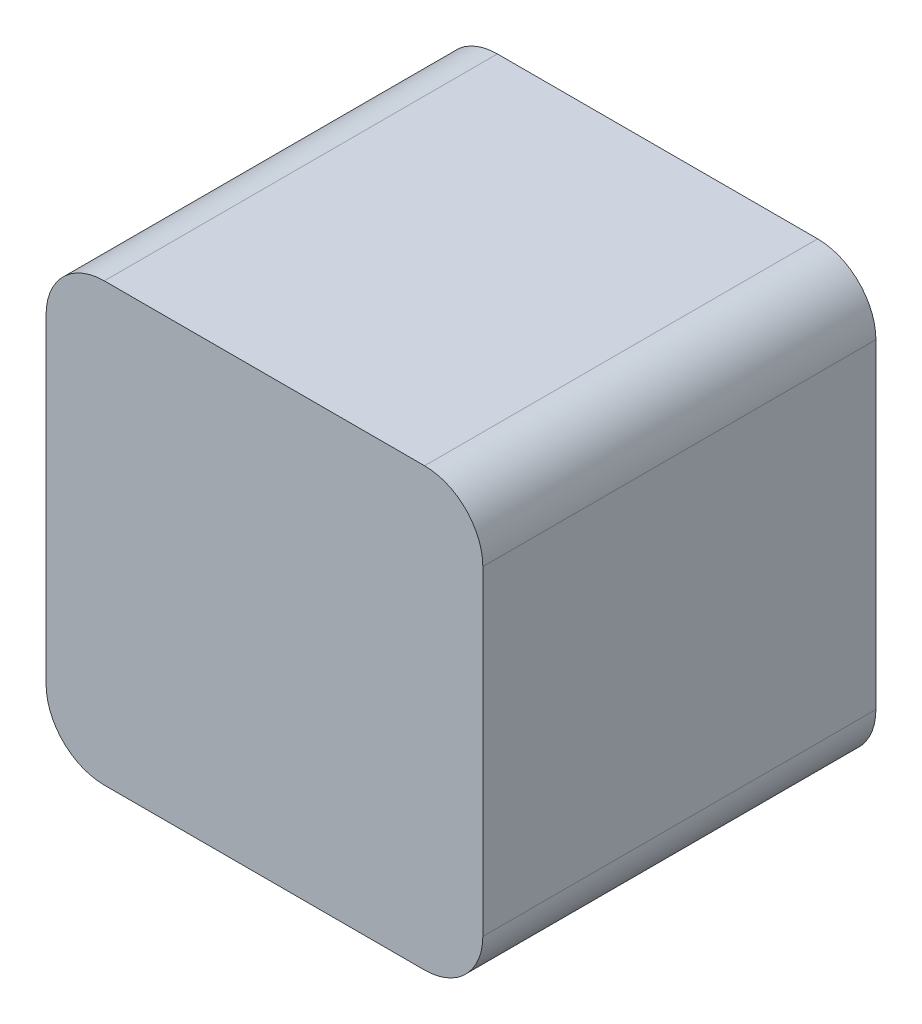
ISO-10303-21;
HEADER;
FILE_DESCRIPTION(('STEP AP214'),'2;1');
FILE_NAME('part.step','',(''),(''),'','','');
FILE_SCHEMA(('AUTOMOTIVE_DESIGN { 1 0 10303 214 1 1 1 1 }'));
ENDSEC;
DATA;
#1=APPLICATION_CONTEXT('core data for automotive mechanical design processes');
#2=APPLICATION_PROTOCOL_DEFINITION('international standard','automotive_design',2000,#1);
#3=PRODUCT_CONTEXT('',#1,'mechanical');
#4=PRODUCT('Part','Part','',(#3));
#5=PRODUCT_RELATED_PRODUCT_CATEGORY('part','',(#4));
#6=PRODUCT_DEFINITION_FORMATION('','',#4);
#7=PRODUCT_DEFINITION_CONTEXT('part definition',#1,'design');
#8=PRODUCT_DEFINITION('design','',#6,#7);
#9=PRODUCT_DEFINITION_SHAPE('','',#8);
#10=(LENGTH_UNIT() NAMED_UNIT(*) SI_UNIT(.MILLI.,.METRE.));
#11=(NAMED_UNIT(*) PLANE_ANGLE_UNIT() SI_UNIT($,.RADIAN.));
#12=(NAMED_UNIT(*) SI_UNIT($,.STERADIAN.) SOLID_ANGLE_UNIT());
#13=UNCERTAINTY_MEASURE_WITH_UNIT(LENGTH_MEASURE(1.E-05),#10,'distance_accuracy_value','');
#14=(GEOMETRIC_REPRESENTATION_CONTEXT(3) GLOBAL_UNCERTAINTY_ASSIGNED_CONTEXT((#13)) GLOBAL_UNIT_ASSIGNED_CONTEXT((#10,
#11,#12)) REPRESENTATION_CONTEXT('',''));
#15=CARTESIAN_POINT('',(0.,0.,0.));
#16=DIRECTION('',(0.,0.,1.));
#17=DIRECTION('',(1.,0.,0.));
#18=AXIS2_PLACEMENT_3D('',#15,#16,#17);
#19=CARTESIAN_POINT('',(7.5,-7.5,-11.));
#20=DIRECTION('',(1.,0.,0.));
#21=DIRECTION('',(0.,0.,-1.));
#22=AXIS2_PLACEMENT_3D('',#19,#20,#21);
#23=PLANE('',#22);
#24=DIRECTION('',(0.,1.,0.));
#25=VECTOR('',#24,1.);
#26=CARTESIAN_POINT('',(7.5,-7.5,-11.));
#27=LINE('',#26,#25);
#28=CARTESIAN_POINT('',(7.5,-5.5,-11.));
#29=VERTEX_POINT('',#28);
#30=CARTESIAN_POINT('',(7.5,5.5,-11.));
#31=VERTEX_POINT('',#30);
#32=EDGE_CURVE('E187',#29,#31,#27,.T.);
#33=ORIENTED_EDGE('',*,*,#32,.T.);
#34=DIRECTION('',(0.,0.,1.));
#35=VECTOR('',#34,1.);
#36=CARTESIAN_POINT('',(7.5,5.5,-11.));
#37=LINE('',#36,#35);
#38=CARTESIAN_POINT('',(7.5,5.5,2.5));
#39=VERTEX_POINT('',#38);
#40=EDGE_CURVE('E127',#31,#39,#37,.T.);
#41=ORIENTED_EDGE('',*,*,#40,.T.);
#42=DIRECTION('',(0.,1.,0.));
#43=VECTOR('',#42,1.);
#44=CARTESIAN_POINT('',(7.5,-5.5,2.5));
#45=LINE('',#44,#43);
#46=CARTESIAN_POINT('',(7.5,-5.5,2.5));
#47=VERTEX_POINT('',#46);
#48=EDGE_CURVE('E131',#47,#39,#45,.T.);
#49=ORIENTED_EDGE('',*,*,#48,.F.);
#50=DIRECTION('',(0.,0.,1.));
#51=VECTOR('',#50,1.);
#52=CARTESIAN_POINT('',(7.5,-5.5,-11.));
#53=LINE('',#52,#51);
#54=EDGE_CURVE('E116',#47,#29,#53,.F.);
#55=ORIENTED_EDGE('',*,*,#54,.T.);
#56=EDGE_LOOP('',(#33,#41,#49,#55));
#57=FACE_BOUND('',#56,.T.);
#58=ADVANCED_FACE('F39',(#57),#23,.T.);
#59=CARTESIAN_POINT('',(-7.5,-7.5,-11.));
#60=DIRECTION('',(0.,-1.,0.));
#61=DIRECTION('',(0.,0.,-1.));
#62=AXIS2_PLACEMENT_3D('',#59,#60,#61);
#63=PLANE('',#62);
#64=DIRECTION('',(1.,0.,0.));
#65=VECTOR('',#64,1.);
#66=CARTESIAN_POINT('',(-7.5,-7.5,-11.));
#67=LINE('',#66,#65);
#68=CARTESIAN_POINT('',(-5.5,-7.5,-11.));
#69=VERTEX_POINT('',#68);
#70=CARTESIAN_POINT('',(5.5,-7.5,-11.));
#71=VERTEX_POINT('',#70);
#72=EDGE_CURVE('E128',#69,#71,#67,.T.);
#73=ORIENTED_EDGE('',*,*,#72,.T.);
#74=DIRECTION('',(0.,0.,1.));
#75=VECTOR('',#74,1.);
#76=CARTESIAN_POINT('',(5.5,-7.5,-11.));
#77=LINE('',#76,#75);
#78=CARTESIAN_POINT('',(5.5,-7.5,2.5));
#79=VERTEX_POINT('',#78);
#80=EDGE_CURVE('E224',#71,#79,#77,.T.);
#81=ORIENTED_EDGE('',*,*,#80,.T.);
#82=DIRECTION('',(1.,0.,0.));
#83=VECTOR('',#82,1.);
#84=CARTESIAN_POINT('',(-5.5,-7.5,2.5));
#85=LINE('',#84,#83);
#86=CARTESIAN_POINT('',(-5.5,-7.5,2.5));
#87=VERTEX_POINT('',#86);
#88=EDGE_CURVE('E143',#87,#79,#85,.T.);
#89=ORIENTED_EDGE('',*,*,#88,.F.);
#90=DIRECTION('',(0.,0.,1.));
#91=VECTOR('',#90,1.);
#92=CARTESIAN_POINT('',(-5.5,-7.5,-11.));
#93=LINE('',#92,#91);
#94=EDGE_CURVE('E221',#87,#69,#93,.F.);
#95=ORIENTED_EDGE('',*,*,#94,.T.);
#96=EDGE_LOOP('',(#73,#81,#89,#95));
#97=FACE_BOUND('',#96,.T.);
#98=ADVANCED_FACE('F233',(#97),#63,.T.);
#99=CARTESIAN_POINT('',(-7.5,-7.5,-11.));
#100=DIRECTION('',(-1.,0.,0.));
#101=DIRECTION('',(0.,0.,1.));
#102=AXIS2_PLACEMENT_3D('',#99,#100,#101);
#103=PLANE('',#102);
#104=DIRECTION('',(0.,0.,1.));
#105=VECTOR('',#104,1.);
#106=CARTESIAN_POINT('',(-7.5,-5.5,-11.));
#107=LINE('',#106,#105);
#108=CARTESIAN_POINT('',(-7.5,-5.5,-11.));
#109=VERTEX_POINT('',#108);
#110=CARTESIAN_POINT('',(-7.5,-5.5,2.5));
#111=VERTEX_POINT('',#110);
#112=EDGE_CURVE('E48',#109,#111,#107,.T.);
#113=ORIENTED_EDGE('',*,*,#112,.T.);
#114=DIRECTION('',(0.,-1.,0.));
#115=VECTOR('',#114,1.);
#116=CARTESIAN_POINT('',(-7.5,5.5,2.5));
#117=LINE('',#116,#115);
#118=CARTESIAN_POINT('',(-7.5,5.5,2.5));
#119=VERTEX_POINT('',#118);
#120=EDGE_CURVE('E157',#119,#111,#117,.T.);
#121=ORIENTED_EDGE('',*,*,#120,.F.);
#122=DIRECTION('',(0.,0.,1.));
#123=VECTOR('',#122,1.);
#124=CARTESIAN_POINT('',(-7.5,5.5,-11.));
#125=LINE('',#124,#123);
#126=CARTESIAN_POINT('',(-7.5,5.5,-11.));
#127=VERTEX_POINT('',#126);
#128=EDGE_CURVE('E11',#119,#127,#125,.F.);
#129=ORIENTED_EDGE('',*,*,#128,.T.);
#130=DIRECTION('',(0.,-1.,0.));
#131=VECTOR('',#130,1.);
#132=CARTESIAN_POINT('',(-7.5,-7.5,-11.));
#133=LINE('',#132,#131);
#134=EDGE_CURVE('E197',#127,#109,#133,.T.);
#135=ORIENTED_EDGE('',*,*,#134,.T.);
#136=EDGE_LOOP('',(#113,#121,#129,#135));
#137=FACE_BOUND('',#136,.T.);
#138=ADVANCED_FACE('F228',(#137),#103,.T.);
#139=CARTESIAN_POINT('',(-7.5,7.5,-11.));
#140=DIRECTION('',(0.,1.,0.));
#141=DIRECTION('',(0.,0.,1.));
#142=AXIS2_PLACEMENT_3D('',#139,#140,#141);
#143=PLANE('',#142);
#144=DIRECTION('',(0.,0.,1.));
#145=VECTOR('',#144,1.);
#146=CARTESIAN_POINT('',(-5.5,7.5,-11.));
#147=LINE('',#146,#145);
#148=CARTESIAN_POINT('',(-5.5,7.5,-11.));
#149=VERTEX_POINT('',#148);
#150=CARTESIAN_POINT('',(-5.5,7.5,2.5));
#151=VERTEX_POINT('',#150);
#152=EDGE_CURVE('E205',#149,#151,#147,.T.);
#153=ORIENTED_EDGE('',*,*,#152,.T.);
#154=DIRECTION('',(-1.,0.,0.));
#155=VECTOR('',#154,1.);
#156=CARTESIAN_POINT('',(5.5,7.5,2.5));
#157=LINE('',#156,#155);
#158=CARTESIAN_POINT('',(5.5,7.5,2.5));
#159=VERTEX_POINT('',#158);
#160=EDGE_CURVE('E149',#159,#151,#157,.T.);
#161=ORIENTED_EDGE('',*,*,#160,.F.);
#162=DIRECTION('',(0.,0.,1.));
#163=VECTOR('',#162,1.);
#164=CARTESIAN_POINT('',(5.5,7.5,-11.));
#165=LINE('',#164,#163);
#166=CARTESIAN_POINT('',(5.5,7.5,-11.));
#167=VERTEX_POINT('',#166);
#168=EDGE_CURVE('E208',#159,#167,#165,.F.);
#169=ORIENTED_EDGE('',*,*,#168,.T.);
#170=DIRECTION('',(-1.,0.,0.));
#171=VECTOR('',#170,1.);
#172=CARTESIAN_POINT('',(-7.5,7.5,-11.));
#173=LINE('',#172,#171);
#174=EDGE_CURVE('E193',#167,#149,#173,.T.);
#175=ORIENTED_EDGE('',*,*,#174,.T.);
#176=EDGE_LOOP('',(#153,#161,#169,#175));
#177=FACE_BOUND('',#176,.T.);
#178=ADVANCED_FACE('F241',(#177),#143,.T.);
#179=CARTESIAN_POINT('',(0.,0.,-11.));
#180=DIRECTION('',(0.,0.,-1.));
#181=DIRECTION('',(-1.,0.,0.));
#182=AXIS2_PLACEMENT_3D('',#179,#180,#181);
#183=PLANE('',#182);
#184=CARTESIAN_POINT('',(0.,0.,-11.));
#185=DIRECTION('',(0.,0.,1.));
#186=DIRECTION('',(1.,0.,0.));
#187=AXIS2_PLACEMENT_3D('',#184,#185,#186);
#188=CIRCLE('',#187,3.);
#189=CARTESIAN_POINT('',(-1.6583123951777,2.5,-11.));
#190=VERTEX_POINT('',#189);
#191=CARTESIAN_POINT('',(1.6583123951777,2.5,-11.));
#192=VERTEX_POINT('',#191);
#193=EDGE_CURVE('E167',#190,#192,#188,.T.);
#194=ORIENTED_EDGE('',*,*,#193,.T.);
#195=DIRECTION('',(-1.,0.,0.));
#196=VECTOR('',#195,1.);
#197=CARTESIAN_POINT('',(-1.6583123951777,2.5,-11.));
#198=LINE('',#197,#196);
#199=EDGE_CURVE('E171',#192,#190,#198,.T.);
#200=ORIENTED_EDGE('',*,*,#199,.T.);
#201=EDGE_LOOP('',(#194,#200));
#202=FACE_BOUND('',#201,.T.);
#203=ORIENTED_EDGE('',*,*,#174,.F.);
#204=CARTESIAN_POINT('',(5.5,5.5,-11.));
#205=DIRECTION('',(0.,0.,-1.));
#206=DIRECTION('',(-1.,0.,0.));
#207=AXIS2_PLACEMENT_3D('',#204,#205,#206);
#208=CIRCLE('',#207,2.);
#209=EDGE_CURVE('E218',#167,#31,#208,.T.);
#210=ORIENTED_EDGE('',*,*,#209,.T.);
#211=ORIENTED_EDGE('',*,*,#32,.F.);
#212=CARTESIAN_POINT('',(5.5,-5.5,-11.));
#213=DIRECTION('',(0.,0.,-1.));
#214=DIRECTION('',(-1.,0.,0.));
#215=AXIS2_PLACEMENT_3D('',#212,#213,#214);
#216=CIRCLE('',#215,2.);
#217=EDGE_CURVE('E122',#29,#71,#216,.T.);
#218=ORIENTED_EDGE('',*,*,#217,.T.);
#219=ORIENTED_EDGE('',*,*,#72,.F.);
#220=CARTESIAN_POINT('',(-5.5,-5.5,-11.));
#221=DIRECTION('',(0.,0.,-1.));
#222=DIRECTION('',(-1.,0.,0.));
#223=AXIS2_PLACEMENT_3D('',#220,#221,#222);
#224=CIRCLE('',#223,2.);
#225=EDGE_CURVE('E55',#69,#109,#224,.T.);
#226=ORIENTED_EDGE('',*,*,#225,.T.);
#227=ORIENTED_EDGE('',*,*,#134,.F.);
#228=CARTESIAN_POINT('',(-5.5,5.5,-11.));
#229=DIRECTION('',(0.,0.,-1.));
#230=DIRECTION('',(-1.,0.,0.));
#231=AXIS2_PLACEMENT_3D('',#228,#229,#230);
#232=CIRCLE('',#231,2.);
#233=EDGE_CURVE('E213',#127,#149,#232,.T.);
#234=ORIENTED_EDGE('',*,*,#233,.T.);
#235=EDGE_LOOP('',(#203,#210,#211,#218,#219,#226,#227,#234));
#236=FACE_BOUND('',#235,.T.);
#237=ADVANCED_FACE('F235',(#202,#236),#183,.T.);
#238=CARTESIAN_POINT('',(0.,0.,-11.));
#239=DIRECTION('',(0.,0.,1.));
#240=DIRECTION('',(1.,0.,0.));
#241=AXIS2_PLACEMENT_3D('',#238,#239,#240);
#242=CYLINDRICAL_SURFACE('',#241,3.);
#243=CARTESIAN_POINT('',(0.,0.,0.));
#244=DIRECTION('',(0.,0.,1.));
#245=DIRECTION('',(1.,0.,0.));
#246=AXIS2_PLACEMENT_3D('',#243,#244,#245);
#247=CIRCLE('',#246,3.);
#248=CARTESIAN_POINT('',(-1.6583123951777,2.5,0.));
#249=VERTEX_POINT('',#248);
#250=CARTESIAN_POINT('',(1.6583123951777,2.5,0.));
#251=VERTEX_POINT('',#250);
#252=EDGE_CURVE('E166',#249,#251,#247,.T.);
#253=ORIENTED_EDGE('',*,*,#252,.T.);
#254=DIRECTION('',(0.,0.,1.));
#255=VECTOR('',#254,1.);
#256=CARTESIAN_POINT('',(1.6583123951777,2.5,-11.));
#257=LINE('',#256,#255);
#258=EDGE_CURVE('E176',#192,#251,#257,.T.);
#259=ORIENTED_EDGE('',*,*,#258,.F.);
#260=ORIENTED_EDGE('',*,*,#193,.F.);
#261=DIRECTION('',(0.,0.,1.));
#262=VECTOR('',#261,1.);
#263=CARTESIAN_POINT('',(-1.6583123951777,2.5,-11.));
#264=LINE('',#263,#262);
#265=EDGE_CURVE('E183',#190,#249,#264,.T.);
#266=ORIENTED_EDGE('',*,*,#265,.T.);
#267=EDGE_LOOP('',(#253,#259,#260,#266));
#268=FACE_BOUND('',#267,.T.);
#269=ADVANCED_FACE('F267',(#268),#242,.F.);
#270=CARTESIAN_POINT('',(-1.6583123951777,2.5,-11.));
#271=DIRECTION('',(0.,1.,0.));
#272=DIRECTION('',(0.,0.,1.));
#273=AXIS2_PLACEMENT_3D('',#270,#271,#272);
#274=PLANE('',#273);
#275=DIRECTION('',(-1.,0.,0.));
#276=VECTOR('',#275,1.);
#277=CARTESIAN_POINT('',(-1.6583123951777,2.5,0.));
#278=LINE('',#277,#276);
#279=EDGE_CURVE('E172',#251,#249,#278,.T.);
#280=ORIENTED_EDGE('',*,*,#279,.T.);
#281=ORIENTED_EDGE('',*,*,#265,.F.);
#282=ORIENTED_EDGE('',*,*,#199,.F.);
#283=ORIENTED_EDGE('',*,*,#258,.T.);
#284=EDGE_LOOP('',(#280,#281,#282,#283));
#285=FACE_BOUND('',#284,.T.);
#286=ADVANCED_FACE('F263',(#285),#274,.F.);
#287=CARTESIAN_POINT('',(5.5,5.5,-11.));
#288=DIRECTION('',(0.,0.,1.));
#289=DIRECTION('',(1.,0.,0.));
#290=AXIS2_PLACEMENT_3D('',#287,#288,#289);
#291=CYLINDRICAL_SURFACE('',#290,2.);
#292=ORIENTED_EDGE('',*,*,#209,.F.);
#293=ORIENTED_EDGE('',*,*,#168,.F.);
#294=CARTESIAN_POINT('',(5.5,5.5,2.5));
#295=DIRECTION('',(0.,0.,1.));
#296=DIRECTION('',(1.,0.,0.));
#297=AXIS2_PLACEMENT_3D('',#294,#295,#296);
#298=CIRCLE('',#297,2.);
#299=EDGE_CURVE('E137',#39,#159,#298,.T.);
#300=ORIENTED_EDGE('',*,*,#299,.F.);
#301=ORIENTED_EDGE('',*,*,#40,.F.);
#302=EDGE_LOOP('',(#292,#293,#300,#301));
#303=FACE_BOUND('',#302,.T.);
#304=ADVANCED_FACE('F238',(#303),#291,.T.);
#305=CARTESIAN_POINT('',(5.5,-5.5,-11.));
#306=DIRECTION('',(0.,0.,1.));
#307=DIRECTION('',(1.,0.,0.));
#308=AXIS2_PLACEMENT_3D('',#305,#306,#307);
#309=CYLINDRICAL_SURFACE('',#308,2.);
#310=ORIENTED_EDGE('',*,*,#217,.F.);
#311=ORIENTED_EDGE('',*,*,#54,.F.);
#312=CARTESIAN_POINT('',(5.5,-5.5,2.5));
#313=DIRECTION('',(0.,0.,1.));
#314=DIRECTION('',(1.,0.,0.));
#315=AXIS2_PLACEMENT_3D('',#312,#313,#314);
#316=CIRCLE('',#315,2.);
#317=EDGE_CURVE('E121',#79,#47,#316,.T.);
#318=ORIENTED_EDGE('',*,*,#317,.F.);
#319=ORIENTED_EDGE('',*,*,#80,.F.);
#320=EDGE_LOOP('',(#310,#311,#318,#319));
#321=FACE_BOUND('',#320,.T.);
#322=ADVANCED_FACE('F118',(#321),#309,.T.);
#323=CARTESIAN_POINT('',(-5.5,5.5,-11.));
#324=DIRECTION('',(0.,0.,1.));
#325=DIRECTION('',(1.,0.,0.));
#326=AXIS2_PLACEMENT_3D('',#323,#324,#325);
#327=CYLINDRICAL_SURFACE('',#326,2.);
#328=ORIENTED_EDGE('',*,*,#233,.F.);
#329=ORIENTED_EDGE('',*,*,#128,.F.);
#330=CARTESIAN_POINT('',(-5.5,5.5,2.5));
#331=DIRECTION('',(0.,0.,1.));
#332=DIRECTION('',(1.,0.,0.));
#333=AXIS2_PLACEMENT_3D('',#330,#331,#332);
#334=CIRCLE('',#333,2.);
#335=EDGE_CURVE('E153',#151,#119,#334,.T.);
#336=ORIENTED_EDGE('',*,*,#335,.F.);
#337=ORIENTED_EDGE('',*,*,#152,.F.);
#338=EDGE_LOOP('',(#328,#329,#336,#337));
#339=FACE_BOUND('',#338,.T.);
#340=ADVANCED_FACE('F245',(#339),#327,.T.);
#341=CARTESIAN_POINT('',(-5.5,-5.5,-11.));
#342=DIRECTION('',(0.,0.,1.));
#343=DIRECTION('',(1.,0.,0.));
#344=AXIS2_PLACEMENT_3D('',#341,#342,#343);
#345=CYLINDRICAL_SURFACE('',#344,2.);
#346=ORIENTED_EDGE('',*,*,#225,.F.);
#347=ORIENTED_EDGE('',*,*,#94,.F.);
#348=CARTESIAN_POINT('',(-5.5,-5.5,2.5));
#349=DIRECTION('',(0.,0.,1.));
#350=DIRECTION('',(1.,0.,0.));
#351=AXIS2_PLACEMENT_3D('',#348,#349,#350);
#352=CIRCLE('',#351,2.);
#353=EDGE_CURVE('E161',#111,#87,#352,.T.);
#354=ORIENTED_EDGE('',*,*,#353,.F.);
#355=ORIENTED_EDGE('',*,*,#112,.F.);
#356=EDGE_LOOP('',(#346,#347,#354,#355));
#357=FACE_BOUND('',#356,.T.);
#358=ADVANCED_FACE('F41',(#357),#345,.T.);
#359=CARTESIAN_POINT('',(5.5,-5.5,0.));
#360=DIRECTION('',(0.,0.,1.));
#361=DIRECTION('',(1.,0.,0.));
#362=AXIS2_PLACEMENT_3D('',#359,#360,#361);
#363=PLANE('',#362);
#364=ORIENTED_EDGE('',*,*,#279,.F.);
#365=ORIENTED_EDGE('',*,*,#252,.F.);
#366=EDGE_LOOP('',(#364,#365));
#367=FACE_BOUND('',#366,.T.);
#368=ADVANCED_FACE('F251',(#367),#363,.F.);
#369=CARTESIAN_POINT('',(5.5,-5.5,2.5));
#370=DIRECTION('',(0.,0.,1.));
#371=DIRECTION('',(1.,0.,0.));
#372=AXIS2_PLACEMENT_3D('',#369,#370,#371);
#373=PLANE('',#372);
#374=ORIENTED_EDGE('',*,*,#317,.T.);
#375=ORIENTED_EDGE('',*,*,#48,.T.);
#376=ORIENTED_EDGE('',*,*,#299,.T.);
#377=ORIENTED_EDGE('',*,*,#160,.T.);
#378=ORIENTED_EDGE('',*,*,#335,.T.);
#379=ORIENTED_EDGE('',*,*,#120,.T.);
#380=ORIENTED_EDGE('',*,*,#353,.T.);
#381=ORIENTED_EDGE('',*,*,#88,.T.);
#382=EDGE_LOOP('',(#374,#375,#376,#377,#378,#379,#380,#381));
#383=FACE_BOUND('',#382,.T.);
#384=ADVANCED_FACE('F140',(#383),#373,.T.);
#385=CLOSED_SHELL('',(#58,#98,#138,#178,#237,#269,#286,#304,#322,#340,#358,#368,#384));
#386=MANIFOLD_SOLID_BREP('B2',#385);
#387=ADVANCED_BREP_SHAPE_REPRESENTATION('',(#18,#386),#14);
#388=SHAPE_DEFINITION_REPRESENTATION(#9,#387);
ENDSEC;
END-ISO-10303-21;
